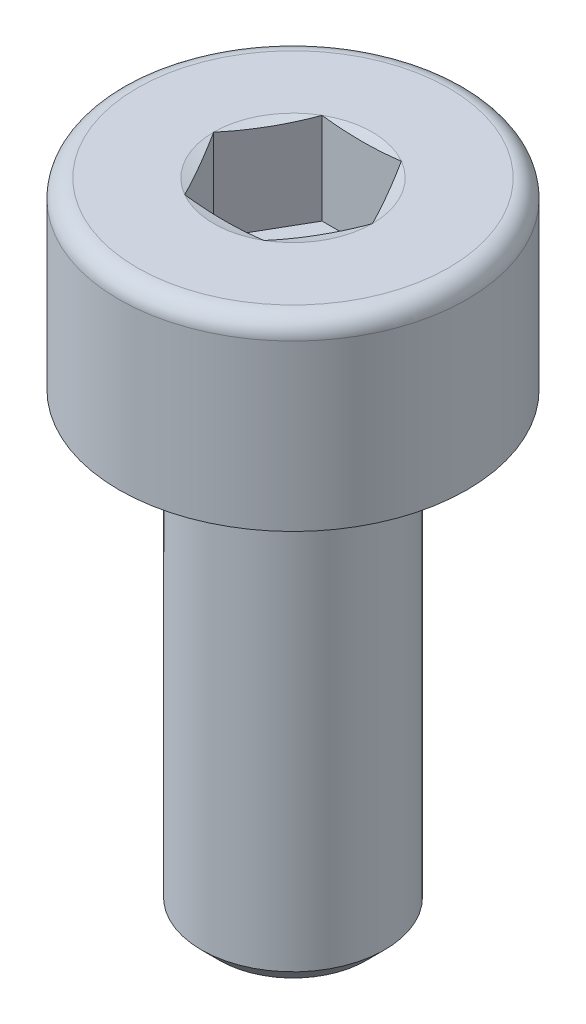
ISO-10303-21;
HEADER;
FILE_DESCRIPTION(('STEP AP214'),'2;1');
FILE_NAME('part.step','',(''),(''),'','','');
FILE_SCHEMA(('AUTOMOTIVE_DESIGN { 1 0 10303 214 1 1 1 1 }'));
ENDSEC;
DATA;
#1=APPLICATION_CONTEXT('core data for automotive mechanical design processes');
#2=APPLICATION_PROTOCOL_DEFINITION('international standard','automotive_design',2000,#1);
#3=PRODUCT_CONTEXT('',#1,'mechanical');
#4=PRODUCT('Part','Part','',(#3));
#5=PRODUCT_RELATED_PRODUCT_CATEGORY('part','',(#4));
#6=PRODUCT_DEFINITION_FORMATION('','',#4);
#7=PRODUCT_DEFINITION_CONTEXT('part definition',#1,'design');
#8=PRODUCT_DEFINITION('design','',#6,#7);
#9=PRODUCT_DEFINITION_SHAPE('','',#8);
#10=(LENGTH_UNIT() NAMED_UNIT(*) SI_UNIT(.MILLI.,.METRE.));
#11=(NAMED_UNIT(*) PLANE_ANGLE_UNIT() SI_UNIT($,.RADIAN.));
#12=(NAMED_UNIT(*) SI_UNIT($,.STERADIAN.) SOLID_ANGLE_UNIT());
#13=UNCERTAINTY_MEASURE_WITH_UNIT(LENGTH_MEASURE(1.E-05),#10,'distance_accuracy_value','');
#14=(GEOMETRIC_REPRESENTATION_CONTEXT(3) GLOBAL_UNCERTAINTY_ASSIGNED_CONTEXT((#13)) GLOBAL_UNIT_ASSIGNED_CONTEXT((#10,
#11,#12)) REPRESENTATION_CONTEXT('',''));
#15=CARTESIAN_POINT('',(0.,0.,0.));
#16=DIRECTION('',(0.,0.,1.));
#17=DIRECTION('',(1.,0.,0.));
#18=AXIS2_PLACEMENT_3D('',#15,#16,#17);
#19=CARTESIAN_POINT('',(-0.43301270189222,1.,-0.75));
#20=DIRECTION('',(0.,-1.,0.));
#21=DIRECTION('',(0.,0.,-1.));
#22=AXIS2_PLACEMENT_3D('',#19,#20,#21);
#23=PLANE('',#22);
#24=DIRECTION('',(0.5,0.,0.866025403784438));
#25=VECTOR('',#24,1.);
#26=CARTESIAN_POINT('',(-0.433012701892219,1.,0.75));
#27=LINE('',#26,#25);
#28=CARTESIAN_POINT('',(-0.866025403784439,1.,0.));
#29=VERTEX_POINT('',#28);
#30=CARTESIAN_POINT('',(-0.433012701892219,1.,0.75));
#31=VERTEX_POINT('',#30);
#32=EDGE_CURVE('E233',#29,#31,#27,.T.);
#33=ORIENTED_EDGE('',*,*,#32,.T.);
#34=DIRECTION('',(1.,0.,0.));
#35=VECTOR('',#34,1.);
#36=CARTESIAN_POINT('',(0.433012701892219,1.,0.75));
#37=LINE('',#36,#35);
#38=CARTESIAN_POINT('',(0.433012701892219,1.,0.75));
#39=VERTEX_POINT('',#38);
#40=EDGE_CURVE('E237',#31,#39,#37,.T.);
#41=ORIENTED_EDGE('',*,*,#40,.T.);
#42=DIRECTION('',(0.5,0.,-0.866025403784438));
#43=VECTOR('',#42,1.);
#44=CARTESIAN_POINT('',(0.866025403784439,1.,0.));
#45=LINE('',#44,#43);
#46=CARTESIAN_POINT('',(0.866025403784439,1.,0.));
#47=VERTEX_POINT('',#46);
#48=EDGE_CURVE('E240',#39,#47,#45,.T.);
#49=ORIENTED_EDGE('',*,*,#48,.T.);
#50=DIRECTION('',(-0.5,0.,-0.866025403784439));
#51=VECTOR('',#50,1.);
#52=CARTESIAN_POINT('',(0.43301270189222,1.,-0.75));
#53=LINE('',#52,#51);
#54=CARTESIAN_POINT('',(0.43301270189222,1.,-0.75));
#55=VERTEX_POINT('',#54);
#56=EDGE_CURVE('E96',#47,#55,#53,.T.);
#57=ORIENTED_EDGE('',*,*,#56,.T.);
#58=DIRECTION('',(-1.,0.,0.));
#59=VECTOR('',#58,1.);
#60=CARTESIAN_POINT('',(-0.43301270189222,1.,-0.75));
#61=LINE('',#60,#59);
#62=CARTESIAN_POINT('',(-0.43301270189222,1.,-0.75));
#63=VERTEX_POINT('',#62);
#64=EDGE_CURVE('E223',#55,#63,#61,.T.);
#65=ORIENTED_EDGE('',*,*,#64,.T.);
#66=DIRECTION('',(-0.5,0.,0.866025403784439));
#67=VECTOR('',#66,1.);
#68=CARTESIAN_POINT('',(-0.866025403784439,1.,0.));
#69=LINE('',#68,#67);
#70=EDGE_CURVE('E228',#63,#29,#69,.T.);
#71=ORIENTED_EDGE('',*,*,#70,.T.);
#72=EDGE_LOOP('',(#33,#41,#49,#57,#65,#71));
#73=FACE_BOUND('',#72,.T.);
#74=ADVANCED_FACE('F17',(#73),#23,.F.);
#75=CARTESIAN_POINT('',(0.866025403784439,1.,0.));
#76=DIRECTION('',(0.866025403784438,0.,0.5));
#77=DIRECTION('',(0.5,0.,-0.866025403784438));
#78=AXIS2_PLACEMENT_3D('',#75,#76,#77);
#79=PLANE('',#78);
#80=CARTESIAN_POINT('',(0.43301270189222,2.,0.75));
#81=CARTESIAN_POINT('',(0.458011996942442,1.99332894284484,0.706699950819609));
#82=CARTESIAN_POINT('',(0.483084241722884,1.9878511257841,0.663273549000079));
#83=CARTESIAN_POINT('',(0.533331856783253,1.97923324222689,0.576242126756357));
#84=CARTESIAN_POINT('',(0.558507237671917,1.9760934226167,0.532637087957293));
#85=CARTESIAN_POINT('',(0.633798363297738,1.97013471304087,0.402229033014321));
#86=CARTESIAN_POINT('',(0.683995304960254,1.9706938931653,0.31528537967027));
#87=CARTESIAN_POINT('',(0.75609458989346,1.97803638281175,0.190405754976572));
#88=CARTESIAN_POINT('',(0.778106545273776,1.98116039104902,0.152279929883928));
#89=CARTESIAN_POINT('',(0.822106353110896,1.98921327605727,0.0760700271867688));
#90=CARTESIAN_POINT('',(0.844093987710657,1.99414690623184,0.0379863269217233));
#91=CARTESIAN_POINT('',(0.866025403784438,2.,0.));
#92=B_SPLINE_CURVE_WITH_KNOTS('',3,(#80,#81,#82,#83,#84,#85,#86,#87,#88,#89,#90,#91),
.UNSPECIFIED.,.F.,.F.,(4,2,2,2,2,4),(0.,0.151285873320482,0.302587719760197,0.603284766353558,
0.735660385742495,0.868386240938901),.UNSPECIFIED.);
#93=CARTESIAN_POINT('',(0.433012701892219,2.,0.75));
#94=VERTEX_POINT('',#93);
#95=CARTESIAN_POINT('',(0.866025403784439,2.,0.));
#96=VERTEX_POINT('',#95);
#97=EDGE_CURVE('E79',#94,#96,#92,.T.);
#98=ORIENTED_EDGE('',*,*,#97,.T.);
#99=DIRECTION('',(0.,1.,0.));
#100=VECTOR('',#99,1.);
#101=CARTESIAN_POINT('',(0.866025403784439,1.,0.));
#102=LINE('',#101,#100);
#103=EDGE_CURVE('E82',#96,#47,#102,.F.);
#104=ORIENTED_EDGE('',*,*,#103,.T.);
#105=ORIENTED_EDGE('',*,*,#48,.F.);
#106=DIRECTION('',(0.,1.,0.));
#107=VECTOR('',#106,1.);
#108=CARTESIAN_POINT('',(0.433012701892219,1.,0.75));
#109=LINE('',#108,#107);
#110=EDGE_CURVE('E75',#39,#94,#109,.T.);
#111=ORIENTED_EDGE('',*,*,#110,.T.);
#112=EDGE_LOOP('',(#98,#104,#105,#111));
#113=FACE_BOUND('',#112,.T.);
#114=ADVANCED_FACE('F81',(#113),#79,.F.);
#115=CARTESIAN_POINT('',(0.433012701892219,1.,0.75));
#116=DIRECTION('',(0.,0.,1.));
#117=DIRECTION('',(1.,0.,0.));
#118=AXIS2_PLACEMENT_3D('',#115,#116,#117);
#119=PLANE('',#118);
#120=CARTESIAN_POINT('',(-0.43301270189222,2.,0.75));
#121=CARTESIAN_POINT('',(-0.383014111791775,1.99332894284484,0.75));
#122=CARTESIAN_POINT('',(-0.332869622230889,1.9878511257841,0.75));
#123=CARTESIAN_POINT('',(-0.232374392110151,1.97923324222689,0.75));
#124=CARTESIAN_POINT('',(-0.182023630332824,1.9760934226167,0.75));
#125=CARTESIAN_POINT('',(-0.0314413790811828,1.97013471304087,0.75));
#126=CARTESIAN_POINT('',(0.0689525042438513,1.9706938931653,0.75));
#127=CARTESIAN_POINT('',(0.213151074110263,1.97803638281175,0.75));
#128=CARTESIAN_POINT('',(0.257174984870893,1.98116039104902,0.75));
#129=CARTESIAN_POINT('',(0.345174600545133,1.98921327605727,0.75));
#130=CARTESIAN_POINT('',(0.389149869744655,1.99414690623184,0.75));
#131=CARTESIAN_POINT('',(0.433012701892219,2.,0.75));
#132=B_SPLINE_CURVE_WITH_KNOTS('',3,(#120,#121,#122,#123,#124,#125,#126,#127,#128,#129,#130,
#131),.UNSPECIFIED.,.F.,.F.,(4,2,2,2,2,4),(0.,0.151285873320482,0.302587719760197,
0.603284766353558,0.735660385742495,0.868386240938901),.UNSPECIFIED.);
#133=CARTESIAN_POINT('',(-0.433012701892219,2.,0.75));
#134=VERTEX_POINT('',#133);
#135=EDGE_CURVE('E87',#134,#94,#132,.T.);
#136=ORIENTED_EDGE('',*,*,#135,.T.);
#137=ORIENTED_EDGE('',*,*,#110,.F.);
#138=ORIENTED_EDGE('',*,*,#40,.F.);
#139=DIRECTION('',(0.,1.,0.));
#140=VECTOR('',#139,1.);
#141=CARTESIAN_POINT('',(-0.433012701892219,1.,0.75));
#142=LINE('',#141,#140);
#143=EDGE_CURVE('E231',#31,#134,#142,.T.);
#144=ORIENTED_EDGE('',*,*,#143,.T.);
#145=EDGE_LOOP('',(#136,#137,#138,#144));
#146=FACE_BOUND('',#145,.T.);
#147=ADVANCED_FACE('F195',(#146),#119,.F.);
#148=CARTESIAN_POINT('',(-0.433012701892219,1.,0.75));
#149=DIRECTION('',(-0.866025403784438,0.,0.5));
#150=DIRECTION('',(0.5,0.,0.866025403784438));
#151=AXIS2_PLACEMENT_3D('',#148,#149,#150);
#152=PLANE('',#151);
#153=CARTESIAN_POINT('',(-0.866025403784439,2.,0.));
#154=CARTESIAN_POINT('',(-0.841026108734216,1.99332894284484,0.0433000491803905));
#155=CARTESIAN_POINT('',(-0.815953863953774,1.9878511257841,0.0867264509999211));
#156=CARTESIAN_POINT('',(-0.765706248893405,1.97923324222689,0.173757873243643));
#157=CARTESIAN_POINT('',(-0.740530868004741,1.9760934226167,0.217362912042706));
#158=CARTESIAN_POINT('',(-0.665239742378921,1.97013471304087,0.347770966985679));
#159=CARTESIAN_POINT('',(-0.615042800716404,1.9706938931653,0.43471462032973));
#160=CARTESIAN_POINT('',(-0.542943515783198,1.97803638281175,0.559594245023428));
#161=CARTESIAN_POINT('',(-0.520931560402882,1.98116039104902,0.597720070116072));
#162=CARTESIAN_POINT('',(-0.476931752565762,1.98921327605727,0.673929972813231));
#163=CARTESIAN_POINT('',(-0.454944117966001,1.99414690623184,0.712013673078277));
#164=CARTESIAN_POINT('',(-0.433012701892219,2.,0.75));
#165=B_SPLINE_CURVE_WITH_KNOTS('',3,(#153,#154,#155,#156,#157,#158,#159,#160,#161,#162,#163,
#164),.UNSPECIFIED.,.F.,.F.,(4,2,2,2,2,4),(0.,0.151285873320482,0.302587719760197,
0.603284766353558,0.735660385742495,0.868386240938901),.UNSPECIFIED.);
#166=CARTESIAN_POINT('',(-0.866025403784439,2.,0.));
#167=VERTEX_POINT('',#166);
#168=EDGE_CURVE('E179',#167,#134,#165,.T.);
#169=ORIENTED_EDGE('',*,*,#168,.T.);
#170=ORIENTED_EDGE('',*,*,#143,.F.);
#171=ORIENTED_EDGE('',*,*,#32,.F.);
#172=DIRECTION('',(0.,1.,0.));
#173=VECTOR('',#172,1.);
#174=CARTESIAN_POINT('',(-0.866025403784439,1.,0.));
#175=LINE('',#174,#173);
#176=EDGE_CURVE('E226',#29,#167,#175,.T.);
#177=ORIENTED_EDGE('',*,*,#176,.T.);
#178=EDGE_LOOP('',(#169,#170,#171,#177));
#179=FACE_BOUND('',#178,.T.);
#180=ADVANCED_FACE('F189',(#179),#152,.F.);
#181=CARTESIAN_POINT('',(-0.866025403784439,1.,0.));
#182=DIRECTION('',(-0.866025403784439,0.,-0.5));
#183=DIRECTION('',(-0.5,0.,0.866025403784439));
#184=AXIS2_PLACEMENT_3D('',#181,#182,#183);
#185=PLANE('',#184);
#186=CARTESIAN_POINT('',(-0.43301270189222,2.,-0.75));
#187=CARTESIAN_POINT('',(-0.458011996942442,1.99332894284484,-0.706699950819609));
#188=CARTESIAN_POINT('',(-0.483084241722885,1.9878511257841,-0.663273549000078));
#189=CARTESIAN_POINT('',(-0.533331856783254,1.97923324222689,-0.576242126756356));
#190=CARTESIAN_POINT('',(-0.558507237671917,1.9760934226167,-0.532637087957293));
#191=CARTESIAN_POINT('',(-0.633798363297738,1.97013471304087,-0.40222903301432));
#192=CARTESIAN_POINT('',(-0.683995304960255,1.9706938931653,-0.31528537967027));
#193=CARTESIAN_POINT('',(-0.756094589893461,1.97803638281175,-0.190405754976572));
#194=CARTESIAN_POINT('',(-0.778106545273776,1.98116039104902,-0.152279929883927));
#195=CARTESIAN_POINT('',(-0.822106353110896,1.98921327605727,-0.0760700271867685));
#196=CARTESIAN_POINT('',(-0.844093987710657,1.99414690623184,-0.0379863269217232));
#197=CARTESIAN_POINT('',(-0.866025403784439,2.,0.));
#198=B_SPLINE_CURVE_WITH_KNOTS('',3,(#186,#187,#188,#189,#190,#191,#192,#193,#194,#195,#196,
#197),.UNSPECIFIED.,.F.,.F.,(4,2,2,2,2,4),(0.,0.151285873320482,0.302587719760197,
0.603284766353558,0.735660385742494,0.8683862409389),.UNSPECIFIED.);
#199=CARTESIAN_POINT('',(-0.43301270189222,2.,-0.75));
#200=VERTEX_POINT('',#199);
#201=EDGE_CURVE('E172',#200,#167,#198,.T.);
#202=ORIENTED_EDGE('',*,*,#201,.T.);
#203=ORIENTED_EDGE('',*,*,#176,.F.);
#204=ORIENTED_EDGE('',*,*,#70,.F.);
#205=DIRECTION('',(0.,1.,0.));
#206=VECTOR('',#205,1.);
#207=CARTESIAN_POINT('',(-0.43301270189222,1.,-0.75));
#208=LINE('',#207,#206);
#209=EDGE_CURVE('E221',#63,#200,#208,.T.);
#210=ORIENTED_EDGE('',*,*,#209,.T.);
#211=EDGE_LOOP('',(#202,#203,#204,#210));
#212=FACE_BOUND('',#211,.T.);
#213=ADVANCED_FACE('F185',(#212),#185,.F.);
#214=CARTESIAN_POINT('',(-0.43301270189222,1.,-0.75));
#215=DIRECTION('',(0.,0.,-1.));
#216=DIRECTION('',(-1.,0.,0.));
#217=AXIS2_PLACEMENT_3D('',#214,#215,#216);
#218=PLANE('',#217);
#219=CARTESIAN_POINT('',(0.433012701892219,2.,-0.75));
#220=CARTESIAN_POINT('',(0.383014111791774,1.99332894284484,-0.75));
#221=CARTESIAN_POINT('',(0.332869622230888,1.9878511257841,-0.75));
#222=CARTESIAN_POINT('',(0.23237439211015,1.97923324222689,-0.75));
#223=CARTESIAN_POINT('',(0.182023630332824,1.9760934226167,-0.75));
#224=CARTESIAN_POINT('',(0.0314413790811823,1.97013471304087,-0.75));
#225=CARTESIAN_POINT('',(-0.0689525042438518,1.9706938931653,-0.750000000000001));
#226=CARTESIAN_POINT('',(-0.213151074110264,1.97803638281175,-0.75));
#227=CARTESIAN_POINT('',(-0.257174984870894,1.98116039104902,-0.75));
#228=CARTESIAN_POINT('',(-0.345174600545134,1.98921327605727,-0.749999999999999));
#229=CARTESIAN_POINT('',(-0.389149869744656,1.99414690623184,-0.749999999999999));
#230=CARTESIAN_POINT('',(-0.43301270189222,2.,-0.749999999999999));
#231=B_SPLINE_CURVE_WITH_KNOTS('',3,(#219,#220,#221,#222,#223,#224,#225,#226,#227,#228,#229,
#230),.UNSPECIFIED.,.F.,.F.,(4,2,2,2,2,4),(0.,0.151285873320482,0.302587719760197,
0.603284766353558,0.735660385742495,0.868386240938901),.UNSPECIFIED.);
#232=CARTESIAN_POINT('',(0.433012701892219,2.,-0.75));
#233=VERTEX_POINT('',#232);
#234=EDGE_CURVE('E112',#233,#200,#231,.T.);
#235=ORIENTED_EDGE('',*,*,#234,.T.);
#236=ORIENTED_EDGE('',*,*,#209,.F.);
#237=ORIENTED_EDGE('',*,*,#64,.F.);
#238=DIRECTION('',(0.,1.,0.));
#239=VECTOR('',#238,1.);
#240=CARTESIAN_POINT('',(0.43301270189222,1.,-0.75));
#241=LINE('',#240,#239);
#242=EDGE_CURVE('E97',#55,#233,#241,.T.);
#243=ORIENTED_EDGE('',*,*,#242,.T.);
#244=EDGE_LOOP('',(#235,#236,#237,#243));
#245=FACE_BOUND('',#244,.T.);
#246=ADVANCED_FACE('F188',(#245),#218,.F.);
#247=CARTESIAN_POINT('',(0.43301270189222,1.,-0.75));
#248=DIRECTION('',(0.866025403784439,0.,-0.5));
#249=DIRECTION('',(-0.5,0.,-0.866025403784439));
#250=AXIS2_PLACEMENT_3D('',#247,#248,#249);
#251=PLANE('',#250);
#252=CARTESIAN_POINT('',(0.866025403784438,2.,0.));
#253=CARTESIAN_POINT('',(0.841026108734216,1.99332894284484,-0.0433000491803904));
#254=CARTESIAN_POINT('',(0.815953863953773,1.9878511257841,-0.0867264509999209));
#255=CARTESIAN_POINT('',(0.765706248893404,1.97923324222689,-0.173757873243643));
#256=CARTESIAN_POINT('',(0.740530868004741,1.9760934226167,-0.217362912042706));
#257=CARTESIAN_POINT('',(0.66523974237892,1.97013471304087,-0.347770966985679));
#258=CARTESIAN_POINT('',(0.615042800716403,1.9706938931653,-0.434714620329729));
#259=CARTESIAN_POINT('',(0.542943515783197,1.97803638281175,-0.559594245023427));
#260=CARTESIAN_POINT('',(0.520931560402882,1.98116039104902,-0.597720070116072));
#261=CARTESIAN_POINT('',(0.476931752565762,1.98921327605727,-0.673929972813232));
#262=CARTESIAN_POINT('',(0.454944117966001,1.99414690623184,-0.712013673078277));
#263=CARTESIAN_POINT('',(0.433012701892219,2.,-0.750000000000001));
#264=B_SPLINE_CURVE_WITH_KNOTS('',3,(#252,#253,#254,#255,#256,#257,#258,#259,#260,#261,#262,
#263),.UNSPECIFIED.,.F.,.F.,(4,2,2,2,2,4),(0.,0.151285873320482,0.302587719760197,
0.603284766353558,0.735660385742495,0.868386240938902),.UNSPECIFIED.);
#265=EDGE_CURVE('E94',#96,#233,#264,.T.);
#266=ORIENTED_EDGE('',*,*,#265,.T.);
#267=ORIENTED_EDGE('',*,*,#242,.F.);
#268=ORIENTED_EDGE('',*,*,#56,.F.);
#269=ORIENTED_EDGE('',*,*,#103,.F.);
#270=EDGE_LOOP('',(#266,#267,#268,#269));
#271=FACE_BOUND('',#270,.T.);
#272=ADVANCED_FACE('F91',(#271),#251,.F.);
#273=CARTESIAN_POINT('',(-0.0925408930275514,4.89857235749242,0.));
#274=DIRECTION('',(0.,0.,1.));
#275=DIRECTION('',(-1.,0.,0.));
#276=AXIS2_PLACEMENT_3D('',#273,#274,#275);
#277=CIRCLE('',#276,3.);
#278=TRIMMED_CURVE('',#277,(PARAMETER_VALUE(-1.60164818522875)),
(PARAMETER_VALUE(1.60164818522875)),.T.,.PARAMETER.);
#279=CARTESIAN_POINT('',(0.,4.89857235749242,0.));
#280=DIRECTION('',(0.,1.,0.));
#281=AXIS1_PLACEMENT('',#279,#280);
#282=SURFACE_OF_REVOLUTION('',#278,#281);
#283=ORIENTED_EDGE('',*,*,#97,.F.);
#284=CARTESIAN_POINT('',(0.,2.,0.));
#285=DIRECTION('',(0.,1.,0.));
#286=DIRECTION('',(-1.,0.,0.));
#287=AXIS2_PLACEMENT_3D('',#284,#285,#286);
#288=CIRCLE('',#287,0.866025403784439);
#289=EDGE_CURVE('E100',#96,#94,#288,.F.);
#290=ORIENTED_EDGE('',*,*,#289,.F.);
#291=EDGE_LOOP('',(#283,#290));
#292=FACE_BOUND('',#291,.T.);
#293=ADVANCED_FACE('F101',(#292),#282,.T.);
#294=CARTESIAN_POINT('',(-0.0925408930275514,4.89857235749242,0.));
#295=DIRECTION('',(0.,0.,1.));
#296=DIRECTION('',(-1.,0.,0.));
#297=AXIS2_PLACEMENT_3D('',#294,#295,#296);
#298=CIRCLE('',#297,3.);
#299=TRIMMED_CURVE('',#298,(PARAMETER_VALUE(-1.60164818522875)),
(PARAMETER_VALUE(1.60164818522875)),.T.,.PARAMETER.);
#300=CARTESIAN_POINT('',(0.,4.89857235749242,0.));
#301=DIRECTION('',(0.,1.,0.));
#302=AXIS1_PLACEMENT('',#300,#301);
#303=SURFACE_OF_REVOLUTION('',#299,#302);
#304=ORIENTED_EDGE('',*,*,#135,.F.);
#305=CARTESIAN_POINT('',(0.,2.,0.));
#306=DIRECTION('',(0.,1.,0.));
#307=DIRECTION('',(-1.,0.,0.));
#308=AXIS2_PLACEMENT_3D('',#305,#306,#307);
#309=CIRCLE('',#308,0.866025403784438);
#310=EDGE_CURVE('E105',#94,#134,#309,.F.);
#311=ORIENTED_EDGE('',*,*,#310,.F.);
#312=EDGE_LOOP('',(#304,#311));
#313=FACE_BOUND('',#312,.T.);
#314=ADVANCED_FACE('F207',(#313),#303,.T.);
#315=CARTESIAN_POINT('',(-0.0925408930275514,4.89857235749242,0.));
#316=DIRECTION('',(0.,0.,1.));
#317=DIRECTION('',(-1.,0.,0.));
#318=AXIS2_PLACEMENT_3D('',#315,#316,#317);
#319=CIRCLE('',#318,3.);
#320=TRIMMED_CURVE('',#319,(PARAMETER_VALUE(-1.60164818522875)),
(PARAMETER_VALUE(1.60164818522875)),.T.,.PARAMETER.);
#321=CARTESIAN_POINT('',(0.,4.89857235749242,0.));
#322=DIRECTION('',(0.,1.,0.));
#323=AXIS1_PLACEMENT('',#321,#322);
#324=SURFACE_OF_REVOLUTION('',#320,#323);
#325=ORIENTED_EDGE('',*,*,#168,.F.);
#326=CARTESIAN_POINT('',(0.,2.,0.));
#327=DIRECTION('',(0.,1.,0.));
#328=DIRECTION('',(-1.,0.,0.));
#329=AXIS2_PLACEMENT_3D('',#326,#327,#328);
#330=CIRCLE('',#329,0.866025403784439);
#331=EDGE_CURVE('E127',#134,#167,#330,.F.);
#332=ORIENTED_EDGE('',*,*,#331,.F.);
#333=EDGE_LOOP('',(#325,#332));
#334=FACE_BOUND('',#333,.T.);
#335=ADVANCED_FACE('F168',(#334),#324,.T.);
#336=CARTESIAN_POINT('',(-0.0925408930275514,4.89857235749242,0.));
#337=DIRECTION('',(0.,0.,1.));
#338=DIRECTION('',(-1.,0.,0.));
#339=AXIS2_PLACEMENT_3D('',#336,#337,#338);
#340=CIRCLE('',#339,3.);
#341=TRIMMED_CURVE('',#340,(PARAMETER_VALUE(-1.60164818522875)),
(PARAMETER_VALUE(1.60164818522875)),.T.,.PARAMETER.);
#342=CARTESIAN_POINT('',(0.,4.89857235749242,0.));
#343=DIRECTION('',(0.,1.,0.));
#344=AXIS1_PLACEMENT('',#342,#343);
#345=SURFACE_OF_REVOLUTION('',#341,#344);
#346=ORIENTED_EDGE('',*,*,#201,.F.);
#347=CARTESIAN_POINT('',(0.,2.,0.));
#348=DIRECTION('',(0.,1.,0.));
#349=DIRECTION('',(-1.,0.,0.));
#350=AXIS2_PLACEMENT_3D('',#347,#348,#349);
#351=CIRCLE('',#350,0.866025403784439);
#352=EDGE_CURVE('E120',#167,#200,#351,.F.);
#353=ORIENTED_EDGE('',*,*,#352,.F.);
#354=EDGE_LOOP('',(#346,#353));
#355=FACE_BOUND('',#354,.T.);
#356=ADVANCED_FACE('F164',(#355),#345,.T.);
#357=CARTESIAN_POINT('',(-0.0925408930275514,4.89857235749242,0.));
#358=DIRECTION('',(0.,0.,1.));
#359=DIRECTION('',(-1.,0.,0.));
#360=AXIS2_PLACEMENT_3D('',#357,#358,#359);
#361=CIRCLE('',#360,3.);
#362=TRIMMED_CURVE('',#361,(PARAMETER_VALUE(-1.60164818522875)),
(PARAMETER_VALUE(1.60164818522875)),.T.,.PARAMETER.);
#363=CARTESIAN_POINT('',(0.,4.89857235749242,0.));
#364=DIRECTION('',(0.,1.,0.));
#365=AXIS1_PLACEMENT('',#363,#364);
#366=SURFACE_OF_REVOLUTION('',#362,#365);
#367=ORIENTED_EDGE('',*,*,#234,.F.);
#368=CARTESIAN_POINT('',(0.,2.,0.));
#369=DIRECTION('',(0.,1.,0.));
#370=DIRECTION('',(-1.,0.,0.));
#371=AXIS2_PLACEMENT_3D('',#368,#369,#370);
#372=CIRCLE('',#371,0.866025403784439);
#373=EDGE_CURVE('E117',#200,#233,#372,.F.);
#374=ORIENTED_EDGE('',*,*,#373,.F.);
#375=EDGE_LOOP('',(#367,#374));
#376=FACE_BOUND('',#375,.T.);
#377=ADVANCED_FACE('F148',(#376),#366,.T.);
#378=CARTESIAN_POINT('',(-0.0925408930275514,4.89857235749242,0.));
#379=DIRECTION('',(0.,0.,1.));
#380=DIRECTION('',(-1.,0.,0.));
#381=AXIS2_PLACEMENT_3D('',#378,#379,#380);
#382=CIRCLE('',#381,3.);
#383=TRIMMED_CURVE('',#382,(PARAMETER_VALUE(-1.60164818522875)),
(PARAMETER_VALUE(1.60164818522875)),.T.,.PARAMETER.);
#384=CARTESIAN_POINT('',(0.,4.89857235749242,0.));
#385=DIRECTION('',(0.,1.,0.));
#386=AXIS1_PLACEMENT('',#384,#385);
#387=SURFACE_OF_REVOLUTION('',#383,#386);
#388=ORIENTED_EDGE('',*,*,#265,.F.);
#389=CARTESIAN_POINT('',(0.,2.,0.));
#390=DIRECTION('',(0.,1.,0.));
#391=DIRECTION('',(-1.,0.,0.));
#392=AXIS2_PLACEMENT_3D('',#389,#390,#391);
#393=CIRCLE('',#392,0.866025403784439);
#394=EDGE_CURVE('E110',#233,#96,#393,.F.);
#395=ORIENTED_EDGE('',*,*,#394,.F.);
#396=EDGE_LOOP('',(#388,#395));
#397=FACE_BOUND('',#396,.T.);
#398=ADVANCED_FACE('F109',(#397),#387,.T.);
#399=CARTESIAN_POINT('',(0.,2.,0.));
#400=DIRECTION('',(0.,1.,0.));
#401=DIRECTION('',(0.,0.,1.));
#402=AXIS2_PLACEMENT_3D('',#399,#400,#401);
#403=PLANE('',#402);
#404=CARTESIAN_POINT('',(0.,2.,0.));
#405=DIRECTION('',(0.,-1.,0.));
#406=DIRECTION('',(0.,0.,-1.));
#407=AXIS2_PLACEMENT_3D('',#404,#405,#406);
#408=CIRCLE('',#407,1.7);
#409=CARTESIAN_POINT('',(0.,2.,-1.7));
#410=VERTEX_POINT('',#409);
#411=CARTESIAN_POINT('',(0.,2.,1.7));
#412=VERTEX_POINT('',#411);
#413=EDGE_CURVE('E36',#410,#412,#408,.T.);
#414=ORIENTED_EDGE('',*,*,#413,.F.);
#415=CARTESIAN_POINT('',(0.,2.,0.));
#416=DIRECTION('',(0.,-1.,0.));
#417=DIRECTION('',(0.,0.,1.));
#418=AXIS2_PLACEMENT_3D('',#415,#416,#417);
#419=CIRCLE('',#418,1.7);
#420=EDGE_CURVE('E119',#412,#410,#419,.T.);
#421=ORIENTED_EDGE('',*,*,#420,.F.);
#422=EDGE_LOOP('',(#414,#421));
#423=FACE_BOUND('',#422,.T.);
#424=ORIENTED_EDGE('',*,*,#373,.T.);
#425=ORIENTED_EDGE('',*,*,#394,.T.);
#426=ORIENTED_EDGE('',*,*,#289,.T.);
#427=ORIENTED_EDGE('',*,*,#310,.T.);
#428=ORIENTED_EDGE('',*,*,#331,.T.);
#429=ORIENTED_EDGE('',*,*,#352,.T.);
#430=EDGE_LOOP('',(#424,#425,#426,#427,#428,#429));
#431=FACE_BOUND('',#430,.T.);
#432=ADVANCED_FACE('F114',(#423,#431),#403,.T.);
#433=CARTESIAN_POINT('',(0.,1.8,0.));
#434=DIRECTION('',(0.,1.,0.));
#435=DIRECTION('',(0.,0.,1.));
#436=AXIS2_PLACEMENT_3D('',#433,#434,#435);
#437=TOROIDAL_SURFACE('',#436,1.7,0.2);
#438=CARTESIAN_POINT('',(0.,1.8,0.));
#439=DIRECTION('',(0.,-1.,0.));
#440=DIRECTION('',(0.,0.,-1.));
#441=AXIS2_PLACEMENT_3D('',#438,#439,#440);
#442=CIRCLE('',#441,1.9);
#443=CARTESIAN_POINT('',(0.,1.8,-1.9));
#444=VERTEX_POINT('',#443);
#445=EDGE_CURVE('E265',#444,#444,#442,.T.);
#446=ORIENTED_EDGE('',*,*,#445,.F.);
#447=EDGE_LOOP('',(#446));
#448=FACE_BOUND('',#447,.T.);
#449=ORIENTED_EDGE('',*,*,#420,.T.);
#450=ORIENTED_EDGE('',*,*,#413,.T.);
#451=EDGE_LOOP('',(#449,#450));
#452=FACE_BOUND('',#451,.T.);
#453=ADVANCED_FACE('F276',(#448,#452),#437,.T.);
#454=CARTESIAN_POINT('',(0.,-5.,0.));
#455=DIRECTION('',(0.,-1.,0.));
#456=DIRECTION('',(0.,0.,-1.));
#457=AXIS2_PLACEMENT_3D('',#454,#455,#456);
#458=PLANE('',#457);
#459=CARTESIAN_POINT('',(0.,-4.99999999999545,0.));
#460=DIRECTION('',(0.,1.,0.));
#461=DIRECTION('',(0.,0.,1.));
#462=AXIS2_PLACEMENT_3D('',#459,#460,#461);
#463=CIRCLE('',#462,0.800000000026557);
#464=CARTESIAN_POINT('',(0.,-4.99999999999545,0.800000000026557));
#465=VERTEX_POINT('',#464);
#466=EDGE_CURVE('E123',#465,#465,#463,.T.);
#467=ORIENTED_EDGE('',*,*,#466,.F.);
#468=EDGE_LOOP('',(#467));
#469=FACE_BOUND('',#468,.T.);
#470=ADVANCED_FACE('F280',(#469),#458,.T.);
#471=CARTESIAN_POINT('',(0.,2.,0.));
#472=DIRECTION('',(0.,-1.,0.));
#473=DIRECTION('',(0.,0.,-1.));
#474=AXIS2_PLACEMENT_3D('',#471,#472,#473);
#475=CYLINDRICAL_SURFACE('',#474,1.9);
#476=ORIENTED_EDGE('',*,*,#445,.T.);
#477=EDGE_LOOP('',(#476));
#478=FACE_BOUND('',#477,.T.);
#479=CARTESIAN_POINT('',(0.,0.,0.));
#480=DIRECTION('',(0.,-1.,0.));
#481=DIRECTION('',(0.,0.,-1.));
#482=AXIS2_PLACEMENT_3D('',#479,#480,#481);
#483=CIRCLE('',#482,1.9);
#484=CARTESIAN_POINT('',(0.,0.,-1.9));
#485=VERTEX_POINT('',#484);
#486=EDGE_CURVE('E258',#485,#485,#483,.F.);
#487=ORIENTED_EDGE('',*,*,#486,.T.);
#488=EDGE_LOOP('',(#487));
#489=FACE_BOUND('',#488,.T.);
#490=ADVANCED_FACE('F285',(#478,#489),#475,.T.);
#491=CARTESIAN_POINT('',(0.,-4.80000000004566,0.));
#492=DIRECTION('',(0.,1.,0.));
#493=DIRECTION('',(0.,0.,1.));
#494=AXIS2_PLACEMENT_3D('',#491,#492,#493);
#495=CONICAL_SURFACE('',#494,0.999999999976353,0.785398163397448);
#496=CARTESIAN_POINT('',(0.,-4.8,0.));
#497=DIRECTION('',(0.,1.,0.));
#498=DIRECTION('',(0.,0.,1.));
#499=AXIS2_PLACEMENT_3D('',#496,#497,#498);
#500=CIRCLE('',#499,1.);
#501=CARTESIAN_POINT('',(0.,-4.8,1.));
#502=VERTEX_POINT('',#501);
#503=EDGE_CURVE('E28',#502,#502,#500,.T.);
#504=ORIENTED_EDGE('',*,*,#503,.F.);
#505=EDGE_LOOP('',(#504));
#506=FACE_BOUND('',#505,.T.);
#507=ORIENTED_EDGE('',*,*,#466,.T.);
#508=EDGE_LOOP('',(#507));
#509=FACE_BOUND('',#508,.T.);
#510=ADVANCED_FACE('F289',(#506,#509),#495,.T.);
#511=CARTESIAN_POINT('',(0.,0.,0.));
#512=DIRECTION('',(0.,1.,0.));
#513=DIRECTION('',(0.,0.,1.));
#514=AXIS2_PLACEMENT_3D('',#511,#512,#513);
#515=PLANE('',#514);
#516=CARTESIAN_POINT('',(0.,0.,0.));
#517=DIRECTION('',(0.,1.,0.));
#518=DIRECTION('',(0.,0.,1.));
#519=AXIS2_PLACEMENT_3D('',#516,#517,#518);
#520=CIRCLE('',#519,1.);
#521=CARTESIAN_POINT('',(0.,0.,1.));
#522=VERTEX_POINT('',#521);
#523=EDGE_CURVE('E11',#522,#522,#520,.F.);
#524=ORIENTED_EDGE('',*,*,#523,.F.);
#525=EDGE_LOOP('',(#524));
#526=FACE_BOUND('',#525,.T.);
#527=ORIENTED_EDGE('',*,*,#486,.F.);
#528=EDGE_LOOP('',(#527));
#529=FACE_BOUND('',#528,.T.);
#530=ADVANCED_FACE('F292',(#526,#529),#515,.F.);
#531=CARTESIAN_POINT('',(0.,-5.,0.));
#532=DIRECTION('',(0.,1.,0.));
#533=DIRECTION('',(0.,0.,1.));
#534=AXIS2_PLACEMENT_3D('',#531,#532,#533);
#535=CYLINDRICAL_SURFACE('',#534,1.);
#536=ORIENTED_EDGE('',*,*,#523,.T.);
#537=EDGE_LOOP('',(#536));
#538=FACE_BOUND('',#537,.T.);
#539=ORIENTED_EDGE('',*,*,#503,.T.);
#540=EDGE_LOOP('',(#539));
#541=FACE_BOUND('',#540,.T.);
#542=ADVANCED_FACE('F296',(#538,#541),#535,.T.);
#543=CLOSED_SHELL('',(#74,#114,#147,#180,#213,#246,#272,#293,#314,#335,#356,#377,#398,#432,#453,
#470,#490,#510,#530,#542));
#544=MANIFOLD_SOLID_BREP('B1',#543);
#545=ADVANCED_BREP_SHAPE_REPRESENTATION('',(#18,#544),#14);
#546=SHAPE_DEFINITION_REPRESENTATION(#9,#545);
ENDSEC;
END-ISO-10303-21;
